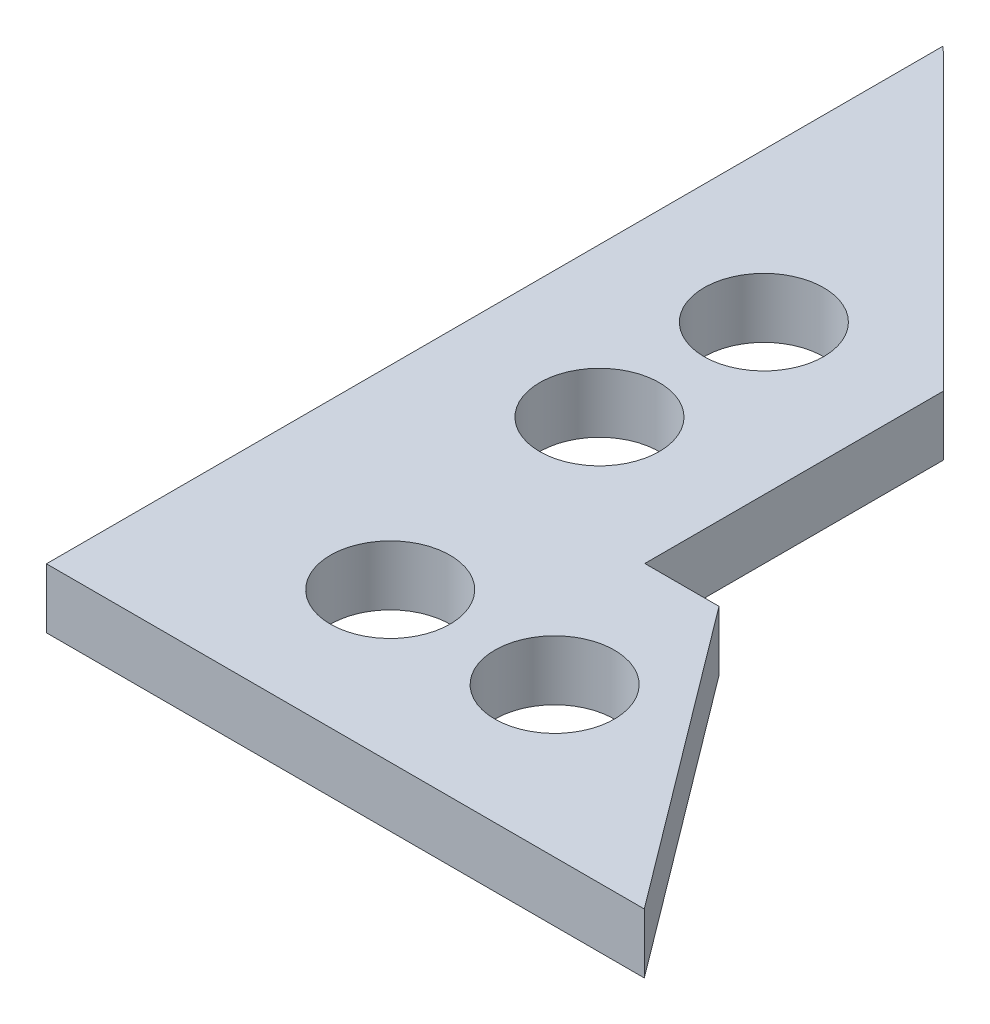
ISO-10303-21;
HEADER;
FILE_DESCRIPTION(('STEP AP214'),'2;1');
FILE_NAME('part.step','',(''),(''),'','','');
FILE_SCHEMA(('AUTOMOTIVE_DESIGN { 1 0 10303 214 1 1 1 1 }'));
ENDSEC;
DATA;
#1=APPLICATION_CONTEXT('core data for automotive mechanical design processes');
#2=APPLICATION_PROTOCOL_DEFINITION('international standard','automotive_design',2000,#1);
#3=PRODUCT_CONTEXT('',#1,'mechanical');
#4=PRODUCT('Part','Part','',(#3));
#5=PRODUCT_RELATED_PRODUCT_CATEGORY('part','',(#4));
#6=PRODUCT_DEFINITION_FORMATION('','',#4);
#7=PRODUCT_DEFINITION_CONTEXT('part definition',#1,'design');
#8=PRODUCT_DEFINITION('design','',#6,#7);
#9=PRODUCT_DEFINITION_SHAPE('','',#8);
#10=(LENGTH_UNIT() NAMED_UNIT(*) SI_UNIT(.MILLI.,.METRE.));
#11=(NAMED_UNIT(*) PLANE_ANGLE_UNIT() SI_UNIT($,.RADIAN.));
#12=(NAMED_UNIT(*) SI_UNIT($,.STERADIAN.) SOLID_ANGLE_UNIT());
#13=UNCERTAINTY_MEASURE_WITH_UNIT(LENGTH_MEASURE(1.E-05),#10,'distance_accuracy_value','');
#14=(GEOMETRIC_REPRESENTATION_CONTEXT(3) GLOBAL_UNCERTAINTY_ASSIGNED_CONTEXT((#13)) GLOBAL_UNIT_ASSIGNED_CONTEXT((#10,
#11,#12)) REPRESENTATION_CONTEXT('',''));
#15=CARTESIAN_POINT('',(0.,0.,0.));
#16=DIRECTION('',(0.,0.,1.));
#17=DIRECTION('',(1.,0.,0.));
#18=AXIS2_PLACEMENT_3D('',#15,#16,#17);
#19=CARTESIAN_POINT('',(0.,5.08,0.));
#20=DIRECTION('',(0.,0.,-1.));
#21=DIRECTION('',(-1.,0.,0.));
#22=AXIS2_PLACEMENT_3D('',#19,#20,#21);
#23=PLANE('',#22);
#24=DIRECTION('',(1.,0.,0.));
#25=VECTOR('',#24,1.);
#26=CARTESIAN_POINT('',(0.,0.,0.));
#27=LINE('',#26,#25);
#28=CARTESIAN_POINT('',(0.,0.,0.));
#29=VERTEX_POINT('',#28);
#30=CARTESIAN_POINT('',(50.8,0.,0.));
#31=VERTEX_POINT('',#30);
#32=EDGE_CURVE('E119',#29,#31,#27,.T.);
#33=ORIENTED_EDGE('',*,*,#32,.T.);
#34=DIRECTION('',(0.,-1.,0.));
#35=VECTOR('',#34,1.);
#36=CARTESIAN_POINT('',(50.8,5.08,0.));
#37=LINE('',#36,#35);
#38=CARTESIAN_POINT('',(50.8,5.08,0.));
#39=VERTEX_POINT('',#38);
#40=EDGE_CURVE('E11',#39,#31,#37,.T.);
#41=ORIENTED_EDGE('',*,*,#40,.F.);
#42=DIRECTION('',(1.,0.,0.));
#43=VECTOR('',#42,1.);
#44=CARTESIAN_POINT('',(0.,5.08,0.));
#45=LINE('',#44,#43);
#46=CARTESIAN_POINT('',(0.,5.08,0.));
#47=VERTEX_POINT('',#46);
#48=EDGE_CURVE('E130',#47,#39,#45,.T.);
#49=ORIENTED_EDGE('',*,*,#48,.F.);
#50=DIRECTION('',(0.,-1.,0.));
#51=VECTOR('',#50,1.);
#52=CARTESIAN_POINT('',(0.,5.08,0.));
#53=LINE('',#52,#51);
#54=EDGE_CURVE('E115',#47,#29,#53,.T.);
#55=ORIENTED_EDGE('',*,*,#54,.T.);
#56=EDGE_LOOP('',(#33,#41,#49,#55));
#57=FACE_BOUND('',#56,.T.);
#58=ADVANCED_FACE('F33',(#57),#23,.F.);
#59=CARTESIAN_POINT('',(50.8,5.08,0.));
#60=DIRECTION('',(-0.799804707689558,0.,0.600260301500624));
#61=DIRECTION('',(0.600260301500624,0.,0.799804707689558));
#62=AXIS2_PLACEMENT_3D('',#59,#60,#61);
#63=PLANE('',#62);
#64=DIRECTION('',(-0.600260301500624,0.,-0.799804707689558));
#65=VECTOR('',#64,1.);
#66=CARTESIAN_POINT('',(50.8,0.,0.));
#67=LINE('',#66,#65);
#68=CARTESIAN_POINT('',(31.7048351501441,0.,-25.442966497772));
#69=VERTEX_POINT('',#68);
#70=EDGE_CURVE('E122',#31,#69,#67,.T.);
#71=ORIENTED_EDGE('',*,*,#70,.T.);
#72=DIRECTION('',(0.,-1.,0.));
#73=VECTOR('',#72,1.);
#74=CARTESIAN_POINT('',(31.7048351501441,5.08,-25.442966497772));
#75=LINE('',#74,#73);
#76=CARTESIAN_POINT('',(31.7048351501441,5.08,-25.442966497772));
#77=VERTEX_POINT('',#76);
#78=EDGE_CURVE('E42',#77,#69,#75,.T.);
#79=ORIENTED_EDGE('',*,*,#78,.F.);
#80=DIRECTION('',(-0.600260301500624,0.,-0.799804707689558));
#81=VECTOR('',#80,1.);
#82=CARTESIAN_POINT('',(50.8,5.08,0.));
#83=LINE('',#82,#81);
#84=EDGE_CURVE('E88',#39,#77,#83,.T.);
#85=ORIENTED_EDGE('',*,*,#84,.F.);
#86=ORIENTED_EDGE('',*,*,#40,.T.);
#87=EDGE_LOOP('',(#71,#79,#85,#86));
#88=FACE_BOUND('',#87,.T.);
#89=ADVANCED_FACE('F160',(#88),#63,.F.);
#90=CARTESIAN_POINT('',(25.4,5.08,-25.442966497772));
#91=DIRECTION('',(0.,0.,1.));
#92=DIRECTION('',(1.,0.,0.));
#93=AXIS2_PLACEMENT_3D('',#90,#91,#92);
#94=PLANE('',#93);
#95=DIRECTION('',(-1.,0.,0.));
#96=VECTOR('',#95,1.);
#97=CARTESIAN_POINT('',(25.4,0.,-25.442966497772));
#98=LINE('',#97,#96);
#99=CARTESIAN_POINT('',(25.4,0.,-25.442966497772));
#100=VERTEX_POINT('',#99);
#101=EDGE_CURVE('E125',#69,#100,#98,.T.);
#102=ORIENTED_EDGE('',*,*,#101,.T.);
#103=DIRECTION('',(0.,-1.,0.));
#104=VECTOR('',#103,1.);
#105=CARTESIAN_POINT('',(25.4,5.08,-25.442966497772));
#106=LINE('',#105,#104);
#107=CARTESIAN_POINT('',(25.4,5.08,-25.442966497772));
#108=VERTEX_POINT('',#107);
#109=EDGE_CURVE('E110',#108,#100,#106,.T.);
#110=ORIENTED_EDGE('',*,*,#109,.F.);
#111=DIRECTION('',(-1.,0.,0.));
#112=VECTOR('',#111,1.);
#113=CARTESIAN_POINT('',(25.4,5.08,-25.442966497772));
#114=LINE('',#113,#112);
#115=EDGE_CURVE('E101',#77,#108,#114,.T.);
#116=ORIENTED_EDGE('',*,*,#115,.F.);
#117=ORIENTED_EDGE('',*,*,#78,.T.);
#118=EDGE_LOOP('',(#102,#110,#116,#117));
#119=FACE_BOUND('',#118,.T.);
#120=ADVANCED_FACE('F163',(#119),#94,.F.);
#121=CARTESIAN_POINT('',(25.4,5.08,-25.442966497772));
#122=DIRECTION('',(-1.,0.,0.));
#123=DIRECTION('',(0.,0.,1.));
#124=AXIS2_PLACEMENT_3D('',#121,#122,#123);
#125=PLANE('',#124);
#126=DIRECTION('',(0.,0.,-1.));
#127=VECTOR('',#126,1.);
#128=CARTESIAN_POINT('',(25.4,0.,-25.442966497772));
#129=LINE('',#128,#127);
#130=CARTESIAN_POINT('',(25.4,0.,-50.8277996489457));
#131=VERTEX_POINT('',#130);
#132=EDGE_CURVE('E109',#100,#131,#129,.T.);
#133=ORIENTED_EDGE('',*,*,#132,.T.);
#134=DIRECTION('',(0.,-1.,0.));
#135=VECTOR('',#134,1.);
#136=CARTESIAN_POINT('',(25.4,5.08,-50.8277996489457));
#137=LINE('',#136,#135);
#138=CARTESIAN_POINT('',(25.4,5.08,-50.8277996489457));
#139=VERTEX_POINT('',#138);
#140=EDGE_CURVE('E106',#139,#131,#137,.T.);
#141=ORIENTED_EDGE('',*,*,#140,.F.);
#142=DIRECTION('',(0.,0.,-1.));
#143=VECTOR('',#142,1.);
#144=CARTESIAN_POINT('',(25.4,5.08,-25.442966497772));
#145=LINE('',#144,#143);
#146=EDGE_CURVE('E95',#108,#139,#145,.T.);
#147=ORIENTED_EDGE('',*,*,#146,.F.);
#148=ORIENTED_EDGE('',*,*,#109,.T.);
#149=EDGE_LOOP('',(#133,#141,#147,#148));
#150=FACE_BOUND('',#149,.T.);
#151=ADVANCED_FACE('F107',(#150),#125,.F.);
#152=CARTESIAN_POINT('',(25.4,5.08,-50.8277996489457));
#153=DIRECTION('',(-0.706719508254636,0.,0.707493842130323));
#154=DIRECTION('',(0.707493842130323,0.,0.706719508254636));
#155=AXIS2_PLACEMENT_3D('',#152,#153,#154);
#156=PLANE('',#155);
#157=DIRECTION('',(-0.707493842130323,0.,-0.706719508254636));
#158=VECTOR('',#157,1.);
#159=CARTESIAN_POINT('',(25.4,0.,-50.8277996489457));
#160=LINE('',#159,#158);
#161=CARTESIAN_POINT('',(0.,0.,-76.2));
#162=VERTEX_POINT('',#161);
#163=EDGE_CURVE('E74',#131,#162,#160,.T.);
#164=ORIENTED_EDGE('',*,*,#163,.T.);
#165=DIRECTION('',(0.,-1.,0.));
#166=VECTOR('',#165,1.);
#167=CARTESIAN_POINT('',(0.,5.08,-76.2));
#168=LINE('',#167,#166);
#169=CARTESIAN_POINT('',(0.,5.08,-76.2));
#170=VERTEX_POINT('',#169);
#171=EDGE_CURVE('E111',#170,#162,#168,.T.);
#172=ORIENTED_EDGE('',*,*,#171,.F.);
#173=DIRECTION('',(-0.707493842130323,0.,-0.706719508254636));
#174=VECTOR('',#173,1.);
#175=CARTESIAN_POINT('',(25.4,5.08,-50.8277996489457));
#176=LINE('',#175,#174);
#177=EDGE_CURVE('E99',#139,#170,#176,.T.);
#178=ORIENTED_EDGE('',*,*,#177,.F.);
#179=ORIENTED_EDGE('',*,*,#140,.T.);
#180=EDGE_LOOP('',(#164,#172,#178,#179));
#181=FACE_BOUND('',#180,.T.);
#182=ADVANCED_FACE('F113',(#181),#156,.F.);
#183=CARTESIAN_POINT('',(0.,5.08,0.));
#184=DIRECTION('',(1.,0.,0.));
#185=DIRECTION('',(0.,0.,-1.));
#186=AXIS2_PLACEMENT_3D('',#183,#184,#185);
#187=PLANE('',#186);
#188=DIRECTION('',(0.,0.,1.));
#189=VECTOR('',#188,1.);
#190=CARTESIAN_POINT('',(0.,0.,0.));
#191=LINE('',#190,#189);
#192=EDGE_CURVE('E80',#162,#29,#191,.T.);
#193=ORIENTED_EDGE('',*,*,#192,.T.);
#194=ORIENTED_EDGE('',*,*,#54,.F.);
#195=DIRECTION('',(0.,0.,1.));
#196=VECTOR('',#195,1.);
#197=CARTESIAN_POINT('',(0.,5.08,0.));
#198=LINE('',#197,#196);
#199=EDGE_CURVE('E51',#170,#47,#198,.T.);
#200=ORIENTED_EDGE('',*,*,#199,.F.);
#201=ORIENTED_EDGE('',*,*,#171,.T.);
#202=EDGE_LOOP('',(#193,#194,#200,#201));
#203=FACE_BOUND('',#202,.T.);
#204=ADVANCED_FACE('F168',(#203),#187,.F.);
#205=CARTESIAN_POINT('',(0.,5.08,0.));
#206=DIRECTION('',(0.,1.,0.));
#207=DIRECTION('',(0.,0.,1.));
#208=AXIS2_PLACEMENT_3D('',#205,#206,#207);
#209=PLANE('',#208);
#210=CARTESIAN_POINT('',(12.7,5.08,-48.26));
#211=DIRECTION('',(0.,1.,0.));
#212=DIRECTION('',(0.,0.,1.));
#213=AXIS2_PLACEMENT_3D('',#210,#211,#212);
#214=CIRCLE('',#213,5.08);
#215=CARTESIAN_POINT('',(12.7,5.08,-43.18));
#216=VERTEX_POINT('',#215);
#217=EDGE_CURVE('E142',#216,#216,#214,.T.);
#218=ORIENTED_EDGE('',*,*,#217,.F.);
#219=EDGE_LOOP('',(#218));
#220=FACE_BOUND('',#219,.T.);
#221=CARTESIAN_POINT('',(16.51,5.08,-12.7));
#222=DIRECTION('',(0.,1.,0.));
#223=DIRECTION('',(0.,0.,1.));
#224=AXIS2_PLACEMENT_3D('',#221,#222,#223);
#225=CIRCLE('',#224,5.08000000000001);
#226=CARTESIAN_POINT('',(16.51,5.08,-7.62));
#227=VERTEX_POINT('',#226);
#228=EDGE_CURVE('E260',#227,#227,#225,.T.);
#229=ORIENTED_EDGE('',*,*,#228,.F.);
#230=EDGE_LOOP('',(#229));
#231=FACE_BOUND('',#230,.T.);
#232=CARTESIAN_POINT('',(30.48,5.08,-12.7));
#233=DIRECTION('',(0.,1.,0.));
#234=DIRECTION('',(0.,0.,1.));
#235=AXIS2_PLACEMENT_3D('',#232,#233,#234);
#236=CIRCLE('',#235,5.08);
#237=CARTESIAN_POINT('',(30.48,5.08,-7.62));
#238=VERTEX_POINT('',#237);
#239=EDGE_CURVE('E155',#238,#238,#236,.T.);
#240=ORIENTED_EDGE('',*,*,#239,.F.);
#241=EDGE_LOOP('',(#240));
#242=FACE_BOUND('',#241,.T.);
#243=CARTESIAN_POINT('',(12.7,5.08,-34.29));
#244=DIRECTION('',(0.,1.,0.));
#245=DIRECTION('',(0.,0.,1.));
#246=AXIS2_PLACEMENT_3D('',#243,#244,#245);
#247=CIRCLE('',#246,5.08000000000001);
#248=CARTESIAN_POINT('',(12.7,5.08,-29.21));
#249=VERTEX_POINT('',#248);
#250=EDGE_CURVE('E138',#249,#249,#247,.T.);
#251=ORIENTED_EDGE('',*,*,#250,.F.);
#252=EDGE_LOOP('',(#251));
#253=FACE_BOUND('',#252,.T.);
#254=ORIENTED_EDGE('',*,*,#48,.T.);
#255=ORIENTED_EDGE('',*,*,#84,.T.);
#256=ORIENTED_EDGE('',*,*,#115,.T.);
#257=ORIENTED_EDGE('',*,*,#146,.T.);
#258=ORIENTED_EDGE('',*,*,#177,.T.);
#259=ORIENTED_EDGE('',*,*,#199,.T.);
#260=EDGE_LOOP('',(#254,#255,#256,#257,#258,#259));
#261=FACE_BOUND('',#260,.T.);
#262=ADVANCED_FACE('F97',(#220,#231,#242,#253,#261),#209,.T.);
#263=CARTESIAN_POINT('',(0.,0.,0.));
#264=DIRECTION('',(0.,1.,0.));
#265=DIRECTION('',(0.,0.,1.));
#266=AXIS2_PLACEMENT_3D('',#263,#264,#265);
#267=PLANE('',#266);
#268=CARTESIAN_POINT('',(12.7,0.,-48.26));
#269=DIRECTION('',(0.,1.,0.));
#270=DIRECTION('',(0.,0.,1.));
#271=AXIS2_PLACEMENT_3D('',#268,#269,#270);
#272=CIRCLE('',#271,5.08);
#273=CARTESIAN_POINT('',(12.7,0.,-43.18));
#274=VERTEX_POINT('',#273);
#275=EDGE_CURVE('E36',#274,#274,#272,.T.);
#276=ORIENTED_EDGE('',*,*,#275,.T.);
#277=EDGE_LOOP('',(#276));
#278=FACE_BOUND('',#277,.T.);
#279=CARTESIAN_POINT('',(16.51,0.,-12.7));
#280=DIRECTION('',(0.,1.,0.));
#281=DIRECTION('',(0.,0.,1.));
#282=AXIS2_PLACEMENT_3D('',#279,#280,#281);
#283=CIRCLE('',#282,5.08000000000001);
#284=CARTESIAN_POINT('',(16.51,0.,-7.62));
#285=VERTEX_POINT('',#284);
#286=EDGE_CURVE('E141',#285,#285,#283,.T.);
#287=ORIENTED_EDGE('',*,*,#286,.T.);
#288=EDGE_LOOP('',(#287));
#289=FACE_BOUND('',#288,.T.);
#290=CARTESIAN_POINT('',(30.48,0.,-12.7));
#291=DIRECTION('',(0.,1.,0.));
#292=DIRECTION('',(0.,0.,1.));
#293=AXIS2_PLACEMENT_3D('',#290,#291,#292);
#294=CIRCLE('',#293,5.08);
#295=CARTESIAN_POINT('',(30.48,0.,-7.62));
#296=VERTEX_POINT('',#295);
#297=EDGE_CURVE('E139',#296,#296,#294,.T.);
#298=ORIENTED_EDGE('',*,*,#297,.T.);
#299=EDGE_LOOP('',(#298));
#300=FACE_BOUND('',#299,.T.);
#301=CARTESIAN_POINT('',(12.7,0.,-34.29));
#302=DIRECTION('',(0.,1.,0.));
#303=DIRECTION('',(0.,0.,1.));
#304=AXIS2_PLACEMENT_3D('',#301,#302,#303);
#305=CIRCLE('',#304,5.08000000000001);
#306=CARTESIAN_POINT('',(12.7,0.,-29.21));
#307=VERTEX_POINT('',#306);
#308=EDGE_CURVE('E123',#307,#307,#305,.T.);
#309=ORIENTED_EDGE('',*,*,#308,.T.);
#310=EDGE_LOOP('',(#309));
#311=FACE_BOUND('',#310,.T.);
#312=ORIENTED_EDGE('',*,*,#32,.F.);
#313=ORIENTED_EDGE('',*,*,#192,.F.);
#314=ORIENTED_EDGE('',*,*,#163,.F.);
#315=ORIENTED_EDGE('',*,*,#132,.F.);
#316=ORIENTED_EDGE('',*,*,#101,.F.);
#317=ORIENTED_EDGE('',*,*,#70,.F.);
#318=EDGE_LOOP('',(#312,#313,#314,#315,#316,#317));
#319=FACE_BOUND('',#318,.T.);
#320=ADVANCED_FACE('F166',(#278,#289,#300,#311,#319),#267,.F.);
#321=CARTESIAN_POINT('',(12.7,-2.54,-34.29));
#322=DIRECTION('',(0.,1.,0.));
#323=DIRECTION('',(0.,0.,1.));
#324=AXIS2_PLACEMENT_3D('',#321,#322,#323);
#325=CYLINDRICAL_SURFACE('',#324,5.08000000000001);
#326=ORIENTED_EDGE('',*,*,#250,.T.);
#327=EDGE_LOOP('',(#326));
#328=FACE_BOUND('',#327,.T.);
#329=ORIENTED_EDGE('',*,*,#308,.F.);
#330=EDGE_LOOP('',(#329));
#331=FACE_BOUND('',#330,.T.);
#332=ADVANCED_FACE('F216',(#328,#331),#325,.F.);
#333=CARTESIAN_POINT('',(30.48,-2.54,-12.7));
#334=DIRECTION('',(0.,1.,0.));
#335=DIRECTION('',(0.,0.,1.));
#336=AXIS2_PLACEMENT_3D('',#333,#334,#335);
#337=CYLINDRICAL_SURFACE('',#336,5.08);
#338=ORIENTED_EDGE('',*,*,#239,.T.);
#339=EDGE_LOOP('',(#338));
#340=FACE_BOUND('',#339,.T.);
#341=ORIENTED_EDGE('',*,*,#297,.F.);
#342=EDGE_LOOP('',(#341));
#343=FACE_BOUND('',#342,.T.);
#344=ADVANCED_FACE('F224',(#340,#343),#337,.F.);
#345=CARTESIAN_POINT('',(16.51,-2.54,-12.7));
#346=DIRECTION('',(0.,1.,0.));
#347=DIRECTION('',(0.,0.,1.));
#348=AXIS2_PLACEMENT_3D('',#345,#346,#347);
#349=CYLINDRICAL_SURFACE('',#348,5.08000000000001);
#350=ORIENTED_EDGE('',*,*,#228,.T.);
#351=EDGE_LOOP('',(#350));
#352=FACE_BOUND('',#351,.T.);
#353=ORIENTED_EDGE('',*,*,#286,.F.);
#354=EDGE_LOOP('',(#353));
#355=FACE_BOUND('',#354,.T.);
#356=ADVANCED_FACE('F233',(#352,#355),#349,.F.);
#357=CARTESIAN_POINT('',(12.7,-2.54,-48.26));
#358=DIRECTION('',(0.,1.,0.));
#359=DIRECTION('',(0.,0.,1.));
#360=AXIS2_PLACEMENT_3D('',#357,#358,#359);
#361=CYLINDRICAL_SURFACE('',#360,5.08);
#362=ORIENTED_EDGE('',*,*,#217,.T.);
#363=EDGE_LOOP('',(#362));
#364=FACE_BOUND('',#363,.T.);
#365=ORIENTED_EDGE('',*,*,#275,.F.);
#366=EDGE_LOOP('',(#365));
#367=FACE_BOUND('',#366,.T.);
#368=ADVANCED_FACE('F243',(#364,#367),#361,.F.);
#369=CLOSED_SHELL('',(#58,#89,#120,#151,#182,#204,#262,#320,#332,#344,#356,#368));
#370=MANIFOLD_SOLID_BREP('B2',#369);
#371=ADVANCED_BREP_SHAPE_REPRESENTATION('',(#18,#370),#14);
#372=SHAPE_DEFINITION_REPRESENTATION(#9,#371);
ENDSEC;
END-ISO-10303-21;
